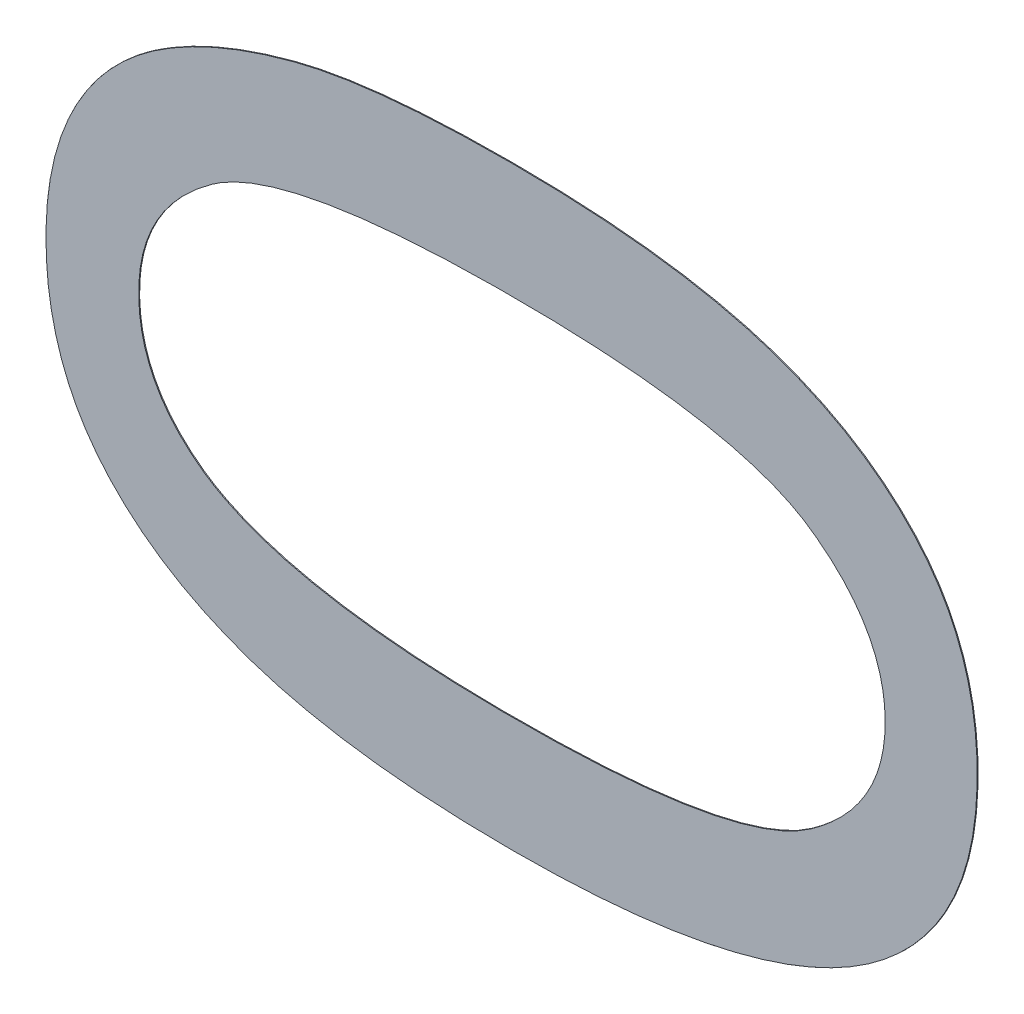
ISO-10303-21;
HEADER;
FILE_DESCRIPTION(('STEP AP214'),'2;1');
FILE_NAME('part.step','',(''),(''),'','','');
FILE_SCHEMA(('AUTOMOTIVE_DESIGN { 1 0 10303 214 1 1 1 1 }'));
ENDSEC;
DATA;
#1=APPLICATION_CONTEXT('core data for automotive mechanical design processes');
#2=APPLICATION_PROTOCOL_DEFINITION('international standard','automotive_design',2000,#1);
#3=PRODUCT_CONTEXT('',#1,'mechanical');
#4=PRODUCT('Part','Part','',(#3));
#5=PRODUCT_RELATED_PRODUCT_CATEGORY('part','',(#4));
#6=PRODUCT_DEFINITION_FORMATION('','',#4);
#7=PRODUCT_DEFINITION_CONTEXT('part definition',#1,'design');
#8=PRODUCT_DEFINITION('design','',#6,#7);
#9=PRODUCT_DEFINITION_SHAPE('','',#8);
#10=(LENGTH_UNIT() NAMED_UNIT(*) SI_UNIT(.MILLI.,.METRE.));
#11=(NAMED_UNIT(*) PLANE_ANGLE_UNIT() SI_UNIT($,.RADIAN.));
#12=(NAMED_UNIT(*) SI_UNIT($,.STERADIAN.) SOLID_ANGLE_UNIT());
#13=UNCERTAINTY_MEASURE_WITH_UNIT(LENGTH_MEASURE(1.E-05),#10,'distance_accuracy_value','');
#14=(GEOMETRIC_REPRESENTATION_CONTEXT(3) GLOBAL_UNCERTAINTY_ASSIGNED_CONTEXT((#13)) GLOBAL_UNIT_ASSIGNED_CONTEXT((#10,
#11,#12)) REPRESENTATION_CONTEXT('',''));
#15=CARTESIAN_POINT('',(0.,0.,0.));
#16=DIRECTION('',(0.,0.,1.));
#17=DIRECTION('',(1.,0.,0.));
#18=AXIS2_PLACEMENT_3D('',#15,#16,#17);
#19=CARTESIAN_POINT('',(76.3692584497314,-9.80798616241844,0.002));
#20=CARTESIAN_POINT('',(76.260466543892,-9.88502148557406,0.002));
#21=CARTESIAN_POINT('',(76.041927562922,-9.92349089420922,0.002));
#22=CARTESIAN_POINT('',(75.3854921219562,-9.92349089420922,0.002));
#23=CARTESIAN_POINT('',(75.1604051565378,-9.88133824432176,0.002));
#24=CARTESIAN_POINT('',(75.0384489461838,-9.79662369551881,0.002));
#25=B_SPLINE_CURVE_WITH_KNOTS('',3,(#19,#20,#21,#22,#23,#24),.UNSPECIFIED.,.F.,.F.,(4,2,4),(0.,
0.207231513519854,0.414463027039707),.UNSPECIFIED.);
#26=DIRECTION('',(0.,0.,-1.));
#27=VECTOR('',#26,1.);
#28=SURFACE_OF_LINEAR_EXTRUSION('',#25,#27);
#29=CARTESIAN_POINT('',(76.3692584497314,-9.80798616241844,0.));
#30=CARTESIAN_POINT('',(76.260466543892,-9.88502148557406,0.));
#31=CARTESIAN_POINT('',(76.041927562922,-9.92349089420922,0.));
#32=CARTESIAN_POINT('',(75.3854921219562,-9.92349089420922,0.));
#33=CARTESIAN_POINT('',(75.1604051565378,-9.88133824432176,0.));
#34=CARTESIAN_POINT('',(75.0384489461838,-9.79662369551881,0.));
#35=B_SPLINE_CURVE_WITH_KNOTS('',3,(#29,#30,#31,#32,#33,#34),.UNSPECIFIED.,.F.,.F.,(4,2,4),(0.,
0.207231513519854,0.414463027039707),.UNSPECIFIED.);
#36=CARTESIAN_POINT('',(76.3692584497314,-9.80798616241844,0.));
#37=VERTEX_POINT('',#36);
#38=CARTESIAN_POINT('',(75.0384489461838,-9.79662369551881,0.));
#39=VERTEX_POINT('',#38);
#40=EDGE_CURVE('E47',#37,#39,#35,.T.);
#41=ORIENTED_EDGE('',*,*,#40,.T.);
#42=DIRECTION('',(0.,0.,-1.));
#43=VECTOR('',#42,1.);
#44=CARTESIAN_POINT('',(75.0384489461838,-9.79662369551881,0.002));
#45=LINE('',#44,#43);
#46=CARTESIAN_POINT('',(75.0384489461838,-9.79662369551881,0.002));
#47=VERTEX_POINT('',#46);
#48=EDGE_CURVE('E52',#47,#39,#45,.T.);
#49=ORIENTED_EDGE('',*,*,#48,.F.);
#50=CARTESIAN_POINT('',(76.3692584497314,-9.80798616241844,0.002));
#51=VERTEX_POINT('',#50);
#52=EDGE_CURVE('E57',#51,#47,#25,.T.);
#53=ORIENTED_EDGE('',*,*,#52,.F.);
#54=DIRECTION('',(0.,0.,-1.));
#55=VECTOR('',#54,1.);
#56=CARTESIAN_POINT('',(76.3692584497314,-9.80798616241844,0.002));
#57=LINE('',#56,#55);
#58=EDGE_CURVE('E59',#37,#51,#57,.F.);
#59=ORIENTED_EDGE('',*,*,#58,.F.);
#60=EDGE_LOOP('',(#41,#49,#53,#59));
#61=FACE_BOUND('',#60,.T.);
#62=ADVANCED_FACE('F17',(#61),#28,.F.);
#63=CARTESIAN_POINT('',(75.1428074483323,-10.1027419684879,0.002));
#64=CARTESIAN_POINT('',(75.2868631062001,-10.1514426028239,0.002));
#65=CARTESIAN_POINT('',(75.4771639042357,-10.1759975445059,0.002));
#66=CARTESIAN_POINT('',(76.0894004501739,-10.1759975445059,0.002));
#67=CARTESIAN_POINT('',(76.3603233067322,-10.1101084509925,0.002));
#68=CARTESIAN_POINT('',(76.6653652573461,-9.86802356143893,0.002));
#69=CARTESIAN_POINT('',(76.7339676693268,-9.71641088602424,0.002));
#70=CARTESIAN_POINT('',(76.7339676693268,-9.37714344178442,0.002));
#71=CARTESIAN_POINT('',(76.6946797626356,-9.25600572948648,0.002));
#72=CARTESIAN_POINT('',(76.5373272789854,-9.06423239003783,0.002));
#73=CARTESIAN_POINT('',(76.4262124002456,-8.99204010640484,0.002));
#74=CARTESIAN_POINT('',(76.1377735458504,-8.89562145252771,0.002));
#75=CARTESIAN_POINT('',(75.9482095355023,-8.87172089216297,0.002));
#76=CARTESIAN_POINT('',(75.5156333128709,-8.87172089216297,0.002));
#77=CARTESIAN_POINT('',(75.358072437078,-8.88645385717218,0.002));
#78=CARTESIAN_POINT('',(75.1240806094317,-8.94699719719253,0.002));
#79=CARTESIAN_POINT('',(75.0249437282586,-8.9879476161245,0.002));
#80=CARTESIAN_POINT('',(74.8620626151013,-9.09353386535717,0.002));
#81=CARTESIAN_POINT('',(74.7998567628402,-9.16024145692663,0.002));
#82=CARTESIAN_POINT('',(74.7138243057895,-9.3224740902223,0.002));
#83=CARTESIAN_POINT('',(74.6918150194393,-9.41643134847563,0.002));
#84=CARTESIAN_POINT('',(74.6918150194393,-9.66934724780038,0.002));
#85=CARTESIAN_POINT('',(74.7311029261306,-9.79007571107027,0.002));
#86=CARTESIAN_POINT('',(74.8876367032985,-9.9818500768153,0.002));
#87=CARTESIAN_POINT('',(74.9987517904645,-10.0540413341519,0.002));
#88=CARTESIAN_POINT('',(75.1428074483323,-10.1027419684879,0.002));
#89=B_SPLINE_CURVE_WITH_KNOTS('',3,(#63,#64,#65,#66,#67,#68,#69,#70,#71,#72,#73,#74,#75,#76,#77,
#78,#79,#80,#81,#82,#83,#84,#85,#86,#87,#88),.UNSPECIFIED.,.T.,.F.,(4,2,2,2,2,2,2,2,2,2,2,2,4),
(0.,0.0792602150925487,0.205144086121895,0.30980090734166,0.389348979521441,0.469100393891661,
0.548580775613777,0.615716036963697,0.682794733535212,0.749873430106736,0.817092869796167,
0.908429207694783,1.),.UNSPECIFIED.);
#90=DIRECTION('',(0.,0.,-1.));
#91=VECTOR('',#90,1.);
#92=SURFACE_OF_LINEAR_EXTRUSION('',#89,#91);
#93=CARTESIAN_POINT('',(75.1428074483323,-10.1027419684879,0.002));
#94=VERTEX_POINT('',#93);
#95=EDGE_CURVE('E73',#94,#94,#89,.T.);
#96=ORIENTED_EDGE('',*,*,#95,.F.);
#97=EDGE_LOOP('',(#96));
#98=FACE_BOUND('',#97,.T.);
#99=CARTESIAN_POINT('',(75.1428074483323,-10.1027419684879,0.));
#100=CARTESIAN_POINT('',(75.2868631062001,-10.1514426028239,0.));
#101=CARTESIAN_POINT('',(75.4771639042357,-10.1759975445059,0.));
#102=CARTESIAN_POINT('',(76.0894004501739,-10.1759975445059,0.));
#103=CARTESIAN_POINT('',(76.3603233067322,-10.1101084509925,0.));
#104=CARTESIAN_POINT('',(76.6653652573461,-9.86802356143893,0.));
#105=CARTESIAN_POINT('',(76.7339676693268,-9.71641088602424,0.));
#106=CARTESIAN_POINT('',(76.7339676693268,-9.37714344178442,0.));
#107=CARTESIAN_POINT('',(76.6946797626356,-9.25600572948648,0.));
#108=CARTESIAN_POINT('',(76.5373272789854,-9.06423239003783,0.));
#109=CARTESIAN_POINT('',(76.4262124002456,-8.99204010640484,0.));
#110=CARTESIAN_POINT('',(76.1377735458504,-8.89562145252771,0.));
#111=CARTESIAN_POINT('',(75.9482095355023,-8.87172089216297,0.));
#112=CARTESIAN_POINT('',(75.5156333128709,-8.87172089216297,0.));
#113=CARTESIAN_POINT('',(75.358072437078,-8.88645385717218,0.));
#114=CARTESIAN_POINT('',(75.1240806094317,-8.94699719719253,0.));
#115=CARTESIAN_POINT('',(75.0249437282586,-8.9879476161245,0.));
#116=CARTESIAN_POINT('',(74.8620626151013,-9.09353386535717,0.));
#117=CARTESIAN_POINT('',(74.7998567628402,-9.16024145692663,0.));
#118=CARTESIAN_POINT('',(74.7138243057895,-9.3224740902223,0.));
#119=CARTESIAN_POINT('',(74.6918150194393,-9.41643134847563,0.));
#120=CARTESIAN_POINT('',(74.6918150194393,-9.66934724780038,0.));
#121=CARTESIAN_POINT('',(74.7311029261306,-9.79007571107027,0.));
#122=CARTESIAN_POINT('',(74.8876367032985,-9.9818500768153,0.));
#123=CARTESIAN_POINT('',(74.9987517904645,-10.0540413341519,0.));
#124=CARTESIAN_POINT('',(75.1428074483323,-10.1027419684879,0.));
#125=B_SPLINE_CURVE_WITH_KNOTS('',3,(#99,#100,#101,#102,#103,#104,#105,#106,#107,#108,#109,#110,
#111,#112,#113,#114,#115,#116,#117,#118,#119,#120,#121,#122,#123,#124),.UNSPECIFIED.,.T.,.F.,(4,
2,2,2,2,2,2,2,2,2,2,2,4),(0.,0.0792602150925487,0.205144086121895,0.30980090734166,
0.389348979521441,0.469100393891661,0.548580775613777,0.615716036963697,0.682794733535212,
0.749873430106736,0.817092869796167,0.908429207694783,1.),.UNSPECIFIED.);
#126=CARTESIAN_POINT('',(75.1428074483323,-10.1027419684879,0.));
#127=VERTEX_POINT('',#126);
#128=EDGE_CURVE('E49',#127,#127,#125,.T.);
#129=ORIENTED_EDGE('',*,*,#128,.T.);
#130=EDGE_LOOP('',(#129));
#131=FACE_BOUND('',#130,.T.);
#132=ADVANCED_FACE('F85',(#98,#131),#92,.F.);
#133=CARTESIAN_POINT('',(75.0384489461838,-9.79662369551881,0.002));
#134=CARTESIAN_POINT('',(74.9430939226519,-9.72909760589328,0.002));
#135=CARTESIAN_POINT('',(74.895211786372,-9.63906281972589,0.002));
#136=CARTESIAN_POINT('',(74.895211786372,-9.41192960916727,0.002));
#137=CARTESIAN_POINT('',(74.9492326580724,-9.31616533660741,0.002));
#138=CARTESIAN_POINT('',(75.165862580934,-9.16248071208678,0.002));
#139=CARTESIAN_POINT('',(75.3846736239001,-9.12422754245967,0.002));
#140=CARTESIAN_POINT('',(76.041109064866,-9.12422754245967,0.002));
#141=CARTESIAN_POINT('',(76.2592387968079,-9.1622877020668,0.002));
#142=CARTESIAN_POINT('',(76.4777777777778,-9.31616533660742,0.002));
#143=CARTESIAN_POINT('',(76.5322078985062,-9.4111111111112,0.002));
#144=CARTESIAN_POINT('',(76.5322078985062,-9.63660732555769,0.002));
#145=CARTESIAN_POINT('',(76.4777777777778,-9.73114385103344,0.002));
#146=CARTESIAN_POINT('',(76.3692584497314,-9.80798616241844,0.002));
#147=B_SPLINE_CURVE_WITH_KNOTS('',3,(#133,#134,#135,#136,#137,#138,#139,#140,#141,#142,#143,
#144,#145,#146),.UNSPECIFIED.,.F.,.F.,(4,2,2,2,2,2,4),(0.414463027039707,0.510939690355596,
0.609170474822683,0.70715483588029,0.804651712554528,0.902148589228766,1.),.UNSPECIFIED.);
#148=DIRECTION('',(0.,0.,-1.));
#149=VECTOR('',#148,1.);
#150=SURFACE_OF_LINEAR_EXTRUSION('',#147,#149);
#151=CARTESIAN_POINT('',(75.0384489461838,-9.79662369551881,0.));
#152=CARTESIAN_POINT('',(74.9430939226519,-9.72909760589328,0.));
#153=CARTESIAN_POINT('',(74.895211786372,-9.63906281972589,0.));
#154=CARTESIAN_POINT('',(74.895211786372,-9.41192960916727,0.));
#155=CARTESIAN_POINT('',(74.9492326580724,-9.31616533660741,0.));
#156=CARTESIAN_POINT('',(75.165862580934,-9.16248071208678,0.));
#157=CARTESIAN_POINT('',(75.3846736239001,-9.12422754245967,0.));
#158=CARTESIAN_POINT('',(76.041109064866,-9.12422754245967,0.));
#159=CARTESIAN_POINT('',(76.2592387968079,-9.1622877020668,0.));
#160=CARTESIAN_POINT('',(76.4777777777778,-9.31616533660742,0.));
#161=CARTESIAN_POINT('',(76.5322078985062,-9.4111111111112,0.));
#162=CARTESIAN_POINT('',(76.5322078985062,-9.63660732555769,0.));
#163=CARTESIAN_POINT('',(76.4777777777778,-9.73114385103344,0.));
#164=CARTESIAN_POINT('',(76.3692584497314,-9.80798616241844,0.));
#165=B_SPLINE_CURVE_WITH_KNOTS('',3,(#151,#152,#153,#154,#155,#156,#157,#158,#159,#160,#161,
#162,#163,#164),.UNSPECIFIED.,.F.,.F.,(4,2,2,2,2,2,4),(0.414463027039707,0.510939690355596,
0.609170474822683,0.70715483588029,0.804651712554528,0.902148589228766,1.),.UNSPECIFIED.);
#166=EDGE_CURVE('E30',#39,#37,#165,.T.);
#167=ORIENTED_EDGE('',*,*,#166,.T.);
#168=ORIENTED_EDGE('',*,*,#58,.T.);
#169=EDGE_CURVE('E11',#47,#51,#147,.T.);
#170=ORIENTED_EDGE('',*,*,#169,.F.);
#171=ORIENTED_EDGE('',*,*,#48,.T.);
#172=EDGE_LOOP('',(#167,#168,#170,#171));
#173=FACE_BOUND('',#172,.T.);
#174=ADVANCED_FACE('F53',(#173),#150,.F.);
#175=CARTESIAN_POINT('',(76.0931958318717,-8.89858324975044,0.002));
#176=DIRECTION('',(0.,0.,-1.));
#177=DIRECTION('',(-1.,0.,0.));
#178=AXIS2_PLACEMENT_3D('',#175,#176,#177);
#179=PLANE('',#178);
#180=ORIENTED_EDGE('',*,*,#95,.T.);
#181=EDGE_LOOP('',(#180));
#182=FACE_BOUND('',#181,.T.);
#183=ORIENTED_EDGE('',*,*,#52,.T.);
#184=ORIENTED_EDGE('',*,*,#169,.T.);
#185=EDGE_LOOP('',(#183,#184));
#186=FACE_BOUND('',#185,.T.);
#187=ADVANCED_FACE('F90',(#182,#186),#179,.F.);
#188=CARTESIAN_POINT('',(76.0931958318717,-8.89858324975044,0.));
#189=DIRECTION('',(0.,0.,-1.));
#190=DIRECTION('',(-1.,0.,0.));
#191=AXIS2_PLACEMENT_3D('',#188,#189,#190);
#192=PLANE('',#191);
#193=ORIENTED_EDGE('',*,*,#128,.F.);
#194=EDGE_LOOP('',(#193));
#195=FACE_BOUND('',#194,.T.);
#196=ORIENTED_EDGE('',*,*,#40,.F.);
#197=ORIENTED_EDGE('',*,*,#166,.F.);
#198=EDGE_LOOP('',(#196,#197));
#199=FACE_BOUND('',#198,.T.);
#200=ADVANCED_FACE('F19',(#195,#199),#192,.T.);
#201=CLOSED_SHELL('',(#62,#132,#174,#187,#200));
#202=MANIFOLD_SOLID_BREP('B1',#201);
#203=ADVANCED_BREP_SHAPE_REPRESENTATION('',(#18,#202),#14);
#204=SHAPE_DEFINITION_REPRESENTATION(#9,#203);
ENDSEC;
END-ISO-10303-21;
